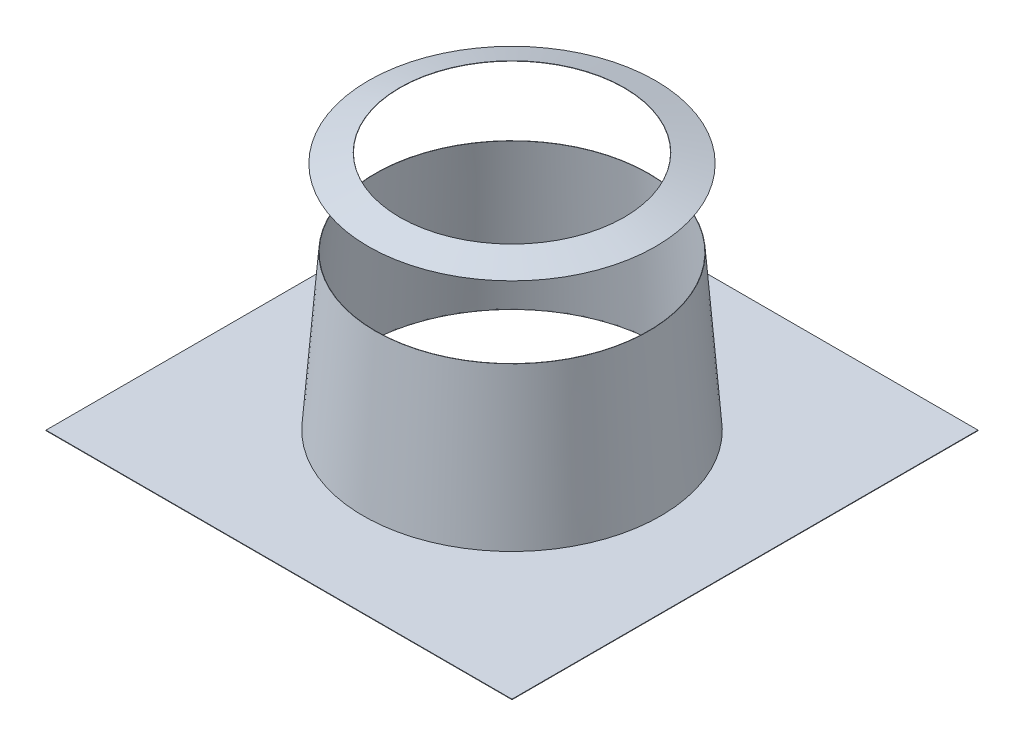
ISO-10303-21;
HEADER;
FILE_DESCRIPTION(('STEP AP214'),'2;1');
FILE_NAME('part.step','',(''),(''),'','','');
FILE_SCHEMA(('AUTOMOTIVE_DESIGN { 1 0 10303 214 1 1 1 1 }'));
ENDSEC;
DATA;
#1=APPLICATION_CONTEXT('core data for automotive mechanical design processes');
#2=APPLICATION_PROTOCOL_DEFINITION('international standard','automotive_design',2000,#1);
#3=PRODUCT_CONTEXT('',#1,'mechanical');
#4=PRODUCT('Part','Part','',(#3));
#5=PRODUCT_RELATED_PRODUCT_CATEGORY('part','',(#4));
#6=PRODUCT_DEFINITION_FORMATION('','',#4);
#7=PRODUCT_DEFINITION_CONTEXT('part definition',#1,'design');
#8=PRODUCT_DEFINITION('design','',#6,#7);
#9=PRODUCT_DEFINITION_SHAPE('','',#8);
#10=(LENGTH_UNIT() NAMED_UNIT(*) SI_UNIT(.MILLI.,.METRE.));
#11=(NAMED_UNIT(*) PLANE_ANGLE_UNIT() SI_UNIT($,.RADIAN.));
#12=(NAMED_UNIT(*) SI_UNIT($,.STERADIAN.) SOLID_ANGLE_UNIT());
#13=UNCERTAINTY_MEASURE_WITH_UNIT(LENGTH_MEASURE(1.E-05),#10,'distance_accuracy_value','');
#14=(GEOMETRIC_REPRESENTATION_CONTEXT(3) GLOBAL_UNCERTAINTY_ASSIGNED_CONTEXT((#13)) GLOBAL_UNIT_ASSIGNED_CONTEXT((#10,
#11,#12)) REPRESENTATION_CONTEXT('',''));
#15=CARTESIAN_POINT('',(0.,0.,0.));
#16=DIRECTION('',(0.,0.,1.));
#17=DIRECTION('',(1.,0.,0.));
#18=AXIS2_PLACEMENT_3D('',#15,#16,#17);
#19=CARTESIAN_POINT('',(0.,249.058788640575,0.));
#20=DIRECTION('',(0.,-1.,0.));
#21=DIRECTION('',(0.,0.,-1.));
#22=AXIS2_PLACEMENT_3D('',#19,#20,#21);
#23=CONICAL_SURFACE('',#22,232.250000000002,1.27353825218208);
#24=CARTESIAN_POINT('',(0.,249.058788640575,0.));
#25=DIRECTION('',(0.,1.,0.));
#26=DIRECTION('',(-1.,0.,0.));
#27=AXIS2_PLACEMENT_3D('',#24,#25,#26);
#28=CIRCLE('',#27,232.250000000002);
#29=CARTESIAN_POINT('',(-232.250000000002,249.058788640575,0.));
#30=VERTEX_POINT('',#29);
#31=EDGE_CURVE('P0_E26',#30,#30,#28,.F.);
#32=ORIENTED_EDGE('',*,*,#31,.F.);
#33=EDGE_LOOP('',(#32));
#34=FACE_BOUND('',#33,.T.);
#35=CARTESIAN_POINT('',(0.,229.491801342467,0.));
#36=DIRECTION('',(0.,-1.,0.));
#37=DIRECTION('',(0.,0.,-1.));
#38=AXIS2_PLACEMENT_3D('',#35,#36,#37);
#39=CIRCLE('',#38,296.124581159378);
#40=CARTESIAN_POINT('',(0.,229.491801342467,-296.124581159378));
#41=VERTEX_POINT('',#40);
#42=EDGE_CURVE('P0_E17',#41,#41,#39,.F.);
#43=ORIENTED_EDGE('',*,*,#42,.F.);
#44=EDGE_LOOP('',(#43));
#45=FACE_BOUND('',#44,.T.);
#46=ADVANCED_FACE('P0_F14',(#34,#45),#23,.F.);
#47=CARTESIAN_POINT('',(-296.81229057969,229.491801342467,0.));
#48=DIRECTION('',(0.,-1.,0.));
#49=DIRECTION('',(0.,0.,-1.));
#50=AXIS2_PLACEMENT_3D('',#47,#48,#49);
#51=PLANE('',#50);
#52=ORIENTED_EDGE('',*,*,#42,.T.);
#53=EDGE_LOOP('',(#52));
#54=FACE_BOUND('',#53,.T.);
#55=CARTESIAN_POINT('',(0.,229.491801342467,0.));
#56=DIRECTION('',(0.,-1.,0.));
#57=DIRECTION('',(0.,0.,-1.));
#58=AXIS2_PLACEMENT_3D('',#55,#56,#57);
#59=CIRCLE('',#58,297.500000000002);
#60=CARTESIAN_POINT('',(0.,229.491801342467,-297.500000000002));
#61=VERTEX_POINT('',#60);
#62=EDGE_CURVE('P0_E21',#61,#61,#59,.F.);
#63=ORIENTED_EDGE('',*,*,#62,.F.);
#64=EDGE_LOOP('',(#63));
#65=FACE_BOUND('',#64,.T.);
#66=ADVANCED_FACE('P0_F34',(#54,#65),#51,.T.);
#67=CARTESIAN_POINT('',(0.,249.058788640575,0.));
#68=DIRECTION('',(0.,1.,0.));
#69=DIRECTION('',(0.,0.,1.));
#70=AXIS2_PLACEMENT_3D('',#67,#68,#69);
#71=CONICAL_SURFACE('',#70,232.250000000002,0.523598775598471);
#72=ORIENTED_EDGE('',*,*,#31,.T.);
#73=EDGE_LOOP('',(#72));
#74=FACE_BOUND('',#73,.T.);
#75=CARTESIAN_POINT('',(0.,249.491801342467,0.));
#76=DIRECTION('',(0.,-1.,0.));
#77=DIRECTION('',(-1.,0.,0.));
#78=AXIS2_PLACEMENT_3D('',#75,#76,#77);
#79=CIRCLE('',#78,232.500000000002);
#80=CARTESIAN_POINT('',(-232.500000000002,249.491801342467,0.));
#81=VERTEX_POINT('',#80);
#82=EDGE_CURVE('P0_E10',#81,#81,#79,.T.);
#83=ORIENTED_EDGE('',*,*,#82,.F.);
#84=EDGE_LOOP('',(#83));
#85=FACE_BOUND('',#84,.T.);
#86=ADVANCED_FACE('P0_F43',(#74,#85),#71,.F.);
#87=CARTESIAN_POINT('',(0.,229.491801342467,0.));
#88=DIRECTION('',(0.,-1.,0.));
#89=DIRECTION('',(0.,0.,-1.));
#90=AXIS2_PLACEMENT_3D('',#87,#88,#89);
#91=CONICAL_SURFACE('',#90,297.500000000002,1.27229739520872);
#92=ORIENTED_EDGE('',*,*,#62,.T.);
#93=EDGE_LOOP('',(#92));
#94=FACE_BOUND('',#93,.T.);
#95=ORIENTED_EDGE('',*,*,#82,.T.);
#96=EDGE_LOOP('',(#95));
#97=FACE_BOUND('',#96,.T.);
#98=ADVANCED_FACE('P0_F44',(#94,#97),#91,.T.);
#99=CLOSED_SHELL('',(#46,#66,#86,#98));
#100=MANIFOLD_SOLID_BREP('P0_B1',#99);
#101=CARTESIAN_POINT('',(0.,70.5081986575334,0.));
#102=DIRECTION('',(0.,-1.,0.));
#103=DIRECTION('',(0.,0.,-1.));
#104=AXIS2_PLACEMENT_3D('',#101,#102,#103);
#105=CONICAL_SURFACE('',#104,282.5,0.0779666338315424);
#106=CARTESIAN_POINT('',(0.,-249.491801342467,0.));
#107=DIRECTION('',(0.,-1.,0.));
#108=DIRECTION('',(0.,0.,-1.));
#109=AXIS2_PLACEMENT_3D('',#106,#107,#108);
#110=CIRCLE('',#109,307.5);
#111=CARTESIAN_POINT('',(0.,-249.491801342467,-307.5));
#112=VERTEX_POINT('',#111);
#113=EDGE_CURVE('P1_E17',#112,#112,#110,.F.);
#114=ORIENTED_EDGE('',*,*,#113,.F.);
#115=EDGE_LOOP('',(#114));
#116=FACE_BOUND('',#115,.T.);
#117=CARTESIAN_POINT('',(0.,70.5081986575333,0.));
#118=DIRECTION('',(0.,-1.,0.));
#119=DIRECTION('',(0.,0.,-1.));
#120=AXIS2_PLACEMENT_3D('',#117,#118,#119);
#121=CIRCLE('',#120,282.5);
#122=CARTESIAN_POINT('',(0.,70.5081986575333,-282.5));
#123=VERTEX_POINT('',#122);
#124=EDGE_CURVE('P1_E26',#123,#123,#121,.T.);
#125=ORIENTED_EDGE('',*,*,#124,.F.);
#126=EDGE_LOOP('',(#125));
#127=FACE_BOUND('',#126,.T.);
#128=ADVANCED_FACE('P1_F14',(#116,#127),#105,.F.);
#129=CARTESIAN_POINT('',(-307.75,-249.491801342467,0.));
#130=DIRECTION('',(0.,-1.,0.));
#131=DIRECTION('',(0.,0.,-1.));
#132=AXIS2_PLACEMENT_3D('',#129,#130,#131);
#133=PLANE('',#132);
#134=ORIENTED_EDGE('',*,*,#113,.T.);
#135=EDGE_LOOP('',(#134));
#136=FACE_BOUND('',#135,.T.);
#137=CARTESIAN_POINT('',(0.,-249.491801342467,0.));
#138=DIRECTION('',(0.,-1.,0.));
#139=DIRECTION('',(0.,0.,-1.));
#140=AXIS2_PLACEMENT_3D('',#137,#138,#139);
#141=CIRCLE('',#140,308.);
#142=CARTESIAN_POINT('',(0.,-249.491801342467,-308.));
#143=VERTEX_POINT('',#142);
#144=EDGE_CURVE('P1_E21',#143,#143,#141,.F.);
#145=ORIENTED_EDGE('',*,*,#144,.F.);
#146=EDGE_LOOP('',(#145));
#147=FACE_BOUND('',#146,.T.);
#148=ADVANCED_FACE('P1_F34',(#136,#147),#133,.T.);
#149=CARTESIAN_POINT('',(-282.75,70.5081986575333,0.));
#150=DIRECTION('',(0.,1.,0.));
#151=DIRECTION('',(0.,0.,1.));
#152=AXIS2_PLACEMENT_3D('',#149,#150,#151);
#153=PLANE('',#152);
#154=CARTESIAN_POINT('',(0.,70.5081986575333,0.));
#155=DIRECTION('',(0.,-1.,0.));
#156=DIRECTION('',(0.,0.,-1.));
#157=AXIS2_PLACEMENT_3D('',#154,#155,#156);
#158=CIRCLE('',#157,283.);
#159=CARTESIAN_POINT('',(0.,70.5081986575333,-283.));
#160=VERTEX_POINT('',#159);
#161=EDGE_CURVE('P1_E10',#160,#160,#158,.T.);
#162=ORIENTED_EDGE('',*,*,#161,.F.);
#163=EDGE_LOOP('',(#162));
#164=FACE_BOUND('',#163,.T.);
#165=ORIENTED_EDGE('',*,*,#124,.T.);
#166=EDGE_LOOP('',(#165));
#167=FACE_BOUND('',#166,.T.);
#168=ADVANCED_FACE('P1_F43',(#164,#167),#153,.T.);
#169=CARTESIAN_POINT('',(0.,-249.491801342467,0.));
#170=DIRECTION('',(0.,-1.,0.));
#171=DIRECTION('',(0.,0.,-1.));
#172=AXIS2_PLACEMENT_3D('',#169,#170,#171);
#173=CONICAL_SURFACE('',#172,308.,0.0779666338315424);
#174=ORIENTED_EDGE('',*,*,#144,.T.);
#175=EDGE_LOOP('',(#174));
#176=FACE_BOUND('',#175,.T.);
#177=ORIENTED_EDGE('',*,*,#161,.T.);
#178=EDGE_LOOP('',(#177));
#179=FACE_BOUND('',#178,.T.);
#180=ADVANCED_FACE('P1_F44',(#176,#179),#173,.T.);
#181=CLOSED_SHELL('',(#128,#148,#168,#180));
#182=MANIFOLD_SOLID_BREP('P1_B1',#181);
#183=CARTESIAN_POINT('',(0.,-249.491801342467,-4.54747350886464E-13));
#184=DIRECTION('',(0.,1.,0.));
#185=DIRECTION('',(0.,0.,1.));
#186=AXIS2_PLACEMENT_3D('',#183,#184,#185);
#187=PLANE('',#186);
#188=DIRECTION('',(0.,0.,1.));
#189=VECTOR('',#188,1.);
#190=CARTESIAN_POINT('',(482.5,-249.491801342467,-482.5));
#191=LINE('',#190,#189);
#192=CARTESIAN_POINT('',(482.5,-249.491801342467,482.5));
#193=VERTEX_POINT('',#192);
#194=CARTESIAN_POINT('',(482.5,-249.491801342467,-482.5));
#195=VERTEX_POINT('',#194);
#196=EDGE_CURVE('P2_E59',#193,#195,#191,.F.);
#197=ORIENTED_EDGE('',*,*,#196,.F.);
#198=DIRECTION('',(1.,0.,0.));
#199=VECTOR('',#198,1.);
#200=CARTESIAN_POINT('',(482.5,-249.491801342467,482.5));
#201=LINE('',#200,#199);
#202=CARTESIAN_POINT('',(-482.5,-249.491801342467,482.5));
#203=VERTEX_POINT('',#202);
#204=EDGE_CURVE('P2_E86',#203,#193,#201,.T.);
#205=ORIENTED_EDGE('',*,*,#204,.F.);
#206=DIRECTION('',(0.,0.,1.));
#207=VECTOR('',#206,1.);
#208=CARTESIAN_POINT('',(-482.500000000001,-249.491801342467,482.5));
#209=LINE('',#208,#207);
#210=CARTESIAN_POINT('',(-482.5,-249.491801342467,-482.5));
#211=VERTEX_POINT('',#210);
#212=EDGE_CURVE('P2_E70',#211,#203,#209,.T.);
#213=ORIENTED_EDGE('',*,*,#212,.F.);
#214=DIRECTION('',(-1.,0.,0.));
#215=VECTOR('',#214,1.);
#216=CARTESIAN_POINT('',(-482.5,-249.491801342467,-482.5));
#217=LINE('',#216,#215);
#218=EDGE_CURVE('P2_E54',#195,#211,#217,.T.);
#219=ORIENTED_EDGE('',*,*,#218,.F.);
#220=EDGE_LOOP('',(#197,#205,#213,#219));
#221=FACE_BOUND('',#220,.T.);
#222=CARTESIAN_POINT('',(0.,-249.491801342467,-4.54747350886464E-13));
#223=DIRECTION('',(0.,1.,0.));
#224=DIRECTION('',(0.,0.,1.));
#225=AXIS2_PLACEMENT_3D('',#222,#223,#224);
#226=CIRCLE('',#225,307.5);
#227=CARTESIAN_POINT('',(0.,-249.491801342467,307.5));
#228=VERTEX_POINT('',#227);
#229=EDGE_CURVE('P2_E19',#228,#228,#226,.T.);
#230=ORIENTED_EDGE('',*,*,#229,.T.);
#231=EDGE_LOOP('',(#230));
#232=FACE_BOUND('',#231,.T.);
#233=ADVANCED_FACE('P2_F16',(#221,#232),#187,.F.);
#234=CARTESIAN_POINT('',(0.,-315.855931531925,-4.54747350886464E-13));
#235=DIRECTION('',(0.,1.,0.));
#236=DIRECTION('',(0.,0.,1.));
#237=AXIS2_PLACEMENT_3D('',#234,#235,#236);
#238=CYLINDRICAL_SURFACE('',#237,307.5);
#239=ORIENTED_EDGE('',*,*,#229,.F.);
#240=EDGE_LOOP('',(#239));
#241=FACE_BOUND('',#240,.T.);
#242=CARTESIAN_POINT('',(0.,-248.491801342467,-4.54747350886464E-13));
#243=DIRECTION('',(0.,1.,0.));
#244=DIRECTION('',(0.,0.,1.));
#245=AXIS2_PLACEMENT_3D('',#242,#243,#244);
#246=CIRCLE('',#245,307.5);
#247=CARTESIAN_POINT('',(0.,-248.491801342467,307.5));
#248=VERTEX_POINT('',#247);
#249=EDGE_CURVE('P2_E80',#248,#248,#246,.F.);
#250=ORIENTED_EDGE('',*,*,#249,.F.);
#251=EDGE_LOOP('',(#250));
#252=FACE_BOUND('',#251,.T.);
#253=ADVANCED_FACE('P2_F112',(#241,#252),#238,.F.);
#254=CARTESIAN_POINT('',(482.5,-249.491801342467,-482.5));
#255=DIRECTION('',(1.,0.,0.));
#256=DIRECTION('',(0.,1.,0.));
#257=AXIS2_PLACEMENT_3D('',#254,#255,#256);
#258=PLANE('',#257);
#259=ORIENTED_EDGE('',*,*,#196,.T.);
#260=DIRECTION('',(0.,1.,0.));
#261=VECTOR('',#260,1.);
#262=CARTESIAN_POINT('',(482.5,-249.491801342467,-482.5));
#263=LINE('',#262,#261);
#264=CARTESIAN_POINT('',(482.5,-248.491801342467,-482.5));
#265=VERTEX_POINT('',#264);
#266=EDGE_CURVE('P2_E61',#265,#195,#263,.F.);
#267=ORIENTED_EDGE('',*,*,#266,.F.);
#268=DIRECTION('',(0.,0.,1.));
#269=VECTOR('',#268,1.);
#270=CARTESIAN_POINT('',(482.5,-248.491801342467,-4.54747350886464E-13));
#271=LINE('',#270,#269);
#272=CARTESIAN_POINT('',(482.5,-248.491801342467,482.5));
#273=VERTEX_POINT('',#272);
#274=EDGE_CURVE('P2_E82',#273,#265,#271,.F.);
#275=ORIENTED_EDGE('',*,*,#274,.F.);
#276=DIRECTION('',(0.,-1.,0.));
#277=VECTOR('',#276,1.);
#278=CARTESIAN_POINT('',(482.5,-249.491801342467,482.5));
#279=LINE('',#278,#277);
#280=EDGE_CURVE('P2_E64',#193,#273,#279,.F.);
#281=ORIENTED_EDGE('',*,*,#280,.F.);
#282=EDGE_LOOP('',(#259,#267,#275,#281));
#283=FACE_BOUND('',#282,.T.);
#284=ADVANCED_FACE('P2_F60',(#283),#258,.T.);
#285=CARTESIAN_POINT('',(-482.5,-249.491801342467,-482.5));
#286=DIRECTION('',(0.,0.,-1.));
#287=DIRECTION('',(-1.,0.,0.));
#288=AXIS2_PLACEMENT_3D('',#285,#286,#287);
#289=PLANE('',#288);
#290=ORIENTED_EDGE('',*,*,#218,.T.);
#291=DIRECTION('',(0.,1.,0.));
#292=VECTOR('',#291,1.);
#293=CARTESIAN_POINT('',(-482.5,-249.491801342467,-482.5));
#294=LINE('',#293,#292);
#295=CARTESIAN_POINT('',(-482.5,-248.491801342467,-482.5));
#296=VERTEX_POINT('',#295);
#297=EDGE_CURVE('P2_E72',#296,#211,#294,.F.);
#298=ORIENTED_EDGE('',*,*,#297,.F.);
#299=DIRECTION('',(1.,0.,0.));
#300=VECTOR('',#299,1.);
#301=CARTESIAN_POINT('',(-4.54747350886464E-13,-248.491801342467,-482.5));
#302=LINE('',#301,#300);
#303=EDGE_CURVE('P2_E76',#265,#296,#302,.F.);
#304=ORIENTED_EDGE('',*,*,#303,.F.);
#305=ORIENTED_EDGE('',*,*,#266,.T.);
#306=EDGE_LOOP('',(#290,#298,#304,#305));
#307=FACE_BOUND('',#306,.T.);
#308=ADVANCED_FACE('P2_F74',(#307),#289,.T.);
#309=CARTESIAN_POINT('',(-482.500000000001,-249.491801342467,482.5));
#310=DIRECTION('',(-1.,0.,0.));
#311=DIRECTION('',(0.,0.,1.));
#312=AXIS2_PLACEMENT_3D('',#309,#310,#311);
#313=PLANE('',#312);
#314=ORIENTED_EDGE('',*,*,#212,.T.);
#315=DIRECTION('',(0.,-1.,0.));
#316=VECTOR('',#315,1.);
#317=CARTESIAN_POINT('',(-482.500000000001,-249.491801342467,482.5));
#318=LINE('',#317,#316);
#319=CARTESIAN_POINT('',(-482.5,-248.491801342467,482.5));
#320=VERTEX_POINT('',#319);
#321=EDGE_CURVE('P2_E34',#320,#203,#318,.T.);
#322=ORIENTED_EDGE('',*,*,#321,.F.);
#323=DIRECTION('',(0.,0.,1.));
#324=VECTOR('',#323,1.);
#325=CARTESIAN_POINT('',(-482.5,-248.491801342467,-4.54747350886464E-13));
#326=LINE('',#325,#324);
#327=EDGE_CURVE('P2_E25',#296,#320,#326,.T.);
#328=ORIENTED_EDGE('',*,*,#327,.F.);
#329=ORIENTED_EDGE('',*,*,#297,.T.);
#330=EDGE_LOOP('',(#314,#322,#328,#329));
#331=FACE_BOUND('',#330,.T.);
#332=ADVANCED_FACE('P2_F93',(#331),#313,.T.);
#333=CARTESIAN_POINT('',(482.5,-249.491801342467,482.5));
#334=DIRECTION('',(0.,0.,1.));
#335=DIRECTION('',(0.,-1.,0.));
#336=AXIS2_PLACEMENT_3D('',#333,#334,#335);
#337=PLANE('',#336);
#338=ORIENTED_EDGE('',*,*,#204,.T.);
#339=ORIENTED_EDGE('',*,*,#280,.T.);
#340=DIRECTION('',(1.,0.,0.));
#341=VECTOR('',#340,1.);
#342=CARTESIAN_POINT('',(-4.54747350886464E-13,-248.491801342467,482.5));
#343=LINE('',#342,#341);
#344=EDGE_CURVE('P2_E11',#320,#273,#343,.T.);
#345=ORIENTED_EDGE('',*,*,#344,.F.);
#346=ORIENTED_EDGE('',*,*,#321,.T.);
#347=EDGE_LOOP('',(#338,#339,#345,#346));
#348=FACE_BOUND('',#347,.T.);
#349=ADVANCED_FACE('P2_F98',(#348),#337,.T.);
#350=CARTESIAN_POINT('',(-4.54747350886464E-13,-248.491801342467,-4.54747350886464E-13));
#351=DIRECTION('',(0.,1.,0.));
#352=DIRECTION('',(0.,0.,1.));
#353=AXIS2_PLACEMENT_3D('',#350,#351,#352);
#354=PLANE('',#353);
#355=ORIENTED_EDGE('',*,*,#327,.T.);
#356=ORIENTED_EDGE('',*,*,#344,.T.);
#357=ORIENTED_EDGE('',*,*,#274,.T.);
#358=ORIENTED_EDGE('',*,*,#303,.T.);
#359=EDGE_LOOP('',(#355,#356,#357,#358));
#360=FACE_BOUND('',#359,.T.);
#361=ORIENTED_EDGE('',*,*,#249,.T.);
#362=EDGE_LOOP('',(#361));
#363=FACE_BOUND('',#362,.T.);
#364=ADVANCED_FACE('P2_F97',(#360,#363),#354,.T.);
#365=CLOSED_SHELL('',(#233,#253,#284,#308,#332,#349,#364));
#366=MANIFOLD_SOLID_BREP('P2_B1',#365);
#367=ADVANCED_BREP_SHAPE_REPRESENTATION('',(#18,#100,#182,#366),#14);
#368=SHAPE_DEFINITION_REPRESENTATION(#9,#367);
ENDSEC;
END-ISO-10303-21;
